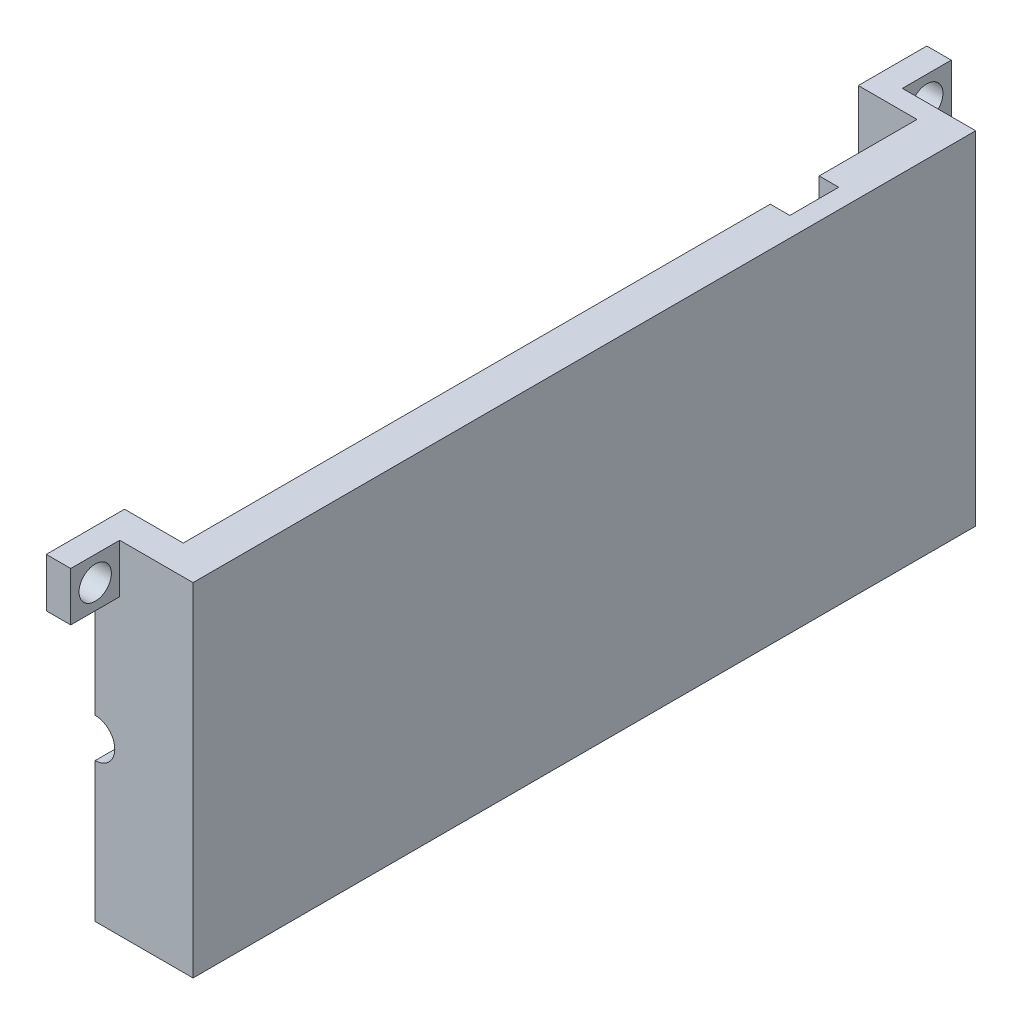
ISO-10303-21;
HEADER;
FILE_DESCRIPTION(('STEP AP214'),'2;1');
FILE_NAME('part.step','',(''),(''),'','','');
FILE_SCHEMA(('AUTOMOTIVE_DESIGN { 1 0 10303 214 1 1 1 1 }'));
ENDSEC;
DATA;
#1=APPLICATION_CONTEXT('core data for automotive mechanical design processes');
#2=APPLICATION_PROTOCOL_DEFINITION('international standard','automotive_design',2000,#1);
#3=PRODUCT_CONTEXT('',#1,'mechanical');
#4=PRODUCT('Part','Part','',(#3));
#5=PRODUCT_RELATED_PRODUCT_CATEGORY('part','',(#4));
#6=PRODUCT_DEFINITION_FORMATION('','',#4);
#7=PRODUCT_DEFINITION_CONTEXT('part definition',#1,'design');
#8=PRODUCT_DEFINITION('design','',#6,#7);
#9=PRODUCT_DEFINITION_SHAPE('','',#8);
#10=(LENGTH_UNIT() NAMED_UNIT(*) SI_UNIT(.MILLI.,.METRE.));
#11=(NAMED_UNIT(*) PLANE_ANGLE_UNIT() SI_UNIT($,.RADIAN.));
#12=(NAMED_UNIT(*) SI_UNIT($,.STERADIAN.) SOLID_ANGLE_UNIT());
#13=UNCERTAINTY_MEASURE_WITH_UNIT(LENGTH_MEASURE(1.E-05),#10,'distance_accuracy_value','');
#14=(GEOMETRIC_REPRESENTATION_CONTEXT(3) GLOBAL_UNCERTAINTY_ASSIGNED_CONTEXT((#13)) GLOBAL_UNIT_ASSIGNED_CONTEXT((#10,
#11,#12)) REPRESENTATION_CONTEXT('',''));
#15=CARTESIAN_POINT('',(0.,0.,0.));
#16=DIRECTION('',(0.,0.,1.));
#17=DIRECTION('',(1.,0.,0.));
#18=AXIS2_PLACEMENT_3D('',#15,#16,#17);
#19=CARTESIAN_POINT('',(9.99999999999998,0.,0.));
#20=DIRECTION('',(1.,0.,0.));
#21=DIRECTION('',(0.,0.,-1.));
#22=AXIS2_PLACEMENT_3D('',#19,#20,#21);
#23=PLANE('',#22);
#24=DIRECTION('',(0.,0.948683298050514,0.316227766016838));
#25=VECTOR('',#24,1.);
#26=CARTESIAN_POINT('',(9.99999999999998,5.,-53.));
#27=LINE('',#26,#25);
#28=CARTESIAN_POINT('',(9.99999999999998,18.25,-48.5833333333333));
#29=VERTEX_POINT('',#28);
#30=CARTESIAN_POINT('',(9.99999999999998,27.5,-45.5));
#31=VERTEX_POINT('',#30);
#32=EDGE_CURVE('E457',#29,#31,#27,.T.);
#33=ORIENTED_EDGE('',*,*,#32,.F.);
#34=DIRECTION('',(0.,0.,-1.));
#35=VECTOR('',#34,1.);
#36=CARTESIAN_POINT('',(9.99999999999998,18.25,5.65685424949239));
#37=LINE('',#36,#35);
#38=CARTESIAN_POINT('',(9.99999999999998,18.25,-42.4166666666666));
#39=VERTEX_POINT('',#38);
#40=EDGE_CURVE('E495',#39,#29,#37,.T.);
#41=ORIENTED_EDGE('',*,*,#40,.F.);
#42=DIRECTION('',(0.,-0.948683298050514,0.316227766016838));
#43=VECTOR('',#42,1.);
#44=CARTESIAN_POINT('',(9.99999999999998,27.5,-45.5));
#45=LINE('',#44,#43);
#46=EDGE_CURVE('E498',#31,#39,#45,.T.);
#47=ORIENTED_EDGE('',*,*,#46,.F.);
#48=EDGE_LOOP('',(#33,#41,#47));
#49=FACE_BOUND('',#48,.T.);
#50=ADVANCED_FACE('F32',(#49),#23,.F.);
#51=DIRECTION('',(0.,0.948683298050514,0.316227766016838));
#52=VECTOR('',#51,1.);
#53=CARTESIAN_POINT('',(9.99999999999998,5.,-33.));
#54=LINE('',#53,#52);
#55=CARTESIAN_POINT('',(9.99999999999998,18.25,-28.5833333333333));
#56=VERTEX_POINT('',#55);
#57=CARTESIAN_POINT('',(9.99999999999998,27.5,-25.5));
#58=VERTEX_POINT('',#57);
#59=EDGE_CURVE('E500',#56,#58,#54,.T.);
#60=ORIENTED_EDGE('',*,*,#59,.F.);
#61=DIRECTION('',(0.,0.,-1.));
#62=VECTOR('',#61,1.);
#63=CARTESIAN_POINT('',(9.99999999999998,18.25,5.65685424949239));
#64=LINE('',#63,#62);
#65=CARTESIAN_POINT('',(9.99999999999998,18.25,-22.4166666666666));
#66=VERTEX_POINT('',#65);
#67=EDGE_CURVE('E477',#66,#56,#64,.T.);
#68=ORIENTED_EDGE('',*,*,#67,.F.);
#69=DIRECTION('',(0.,-0.948683298050514,0.316227766016838));
#70=VECTOR('',#69,1.);
#71=CARTESIAN_POINT('',(9.99999999999998,27.5,-25.5));
#72=LINE('',#71,#70);
#73=EDGE_CURVE('E490',#58,#66,#72,.T.);
#74=ORIENTED_EDGE('',*,*,#73,.F.);
#75=EDGE_LOOP('',(#60,#68,#74));
#76=FACE_BOUND('',#75,.T.);
#77=ADVANCED_FACE('F571',(#76),#23,.F.);
#78=DIRECTION('',(0.,0.948683298050514,0.316227766016838));
#79=VECTOR('',#78,1.);
#80=CARTESIAN_POINT('',(9.99999999999997,5.,-73.));
#81=LINE('',#80,#79);
#82=CARTESIAN_POINT('',(9.99999999999998,18.25,-68.5833333333333));
#83=VERTEX_POINT('',#82);
#84=CARTESIAN_POINT('',(9.99999999999997,27.5,-65.5));
#85=VERTEX_POINT('',#84);
#86=EDGE_CURVE('E465',#83,#85,#81,.T.);
#87=ORIENTED_EDGE('',*,*,#86,.F.);
#88=DIRECTION('',(0.,0.,-1.));
#89=VECTOR('',#88,1.);
#90=CARTESIAN_POINT('',(9.99999999999998,18.25,5.65685424949239));
#91=LINE('',#90,#89);
#92=CARTESIAN_POINT('',(9.99999999999998,18.25,-62.4166666666667));
#93=VERTEX_POINT('',#92);
#94=EDGE_CURVE('E474',#93,#83,#91,.T.);
#95=ORIENTED_EDGE('',*,*,#94,.F.);
#96=DIRECTION('',(0.,-0.948683298050514,0.316227766016838));
#97=VECTOR('',#96,1.);
#98=CARTESIAN_POINT('',(9.99999999999997,27.5,-65.5));
#99=LINE('',#98,#97);
#100=EDGE_CURVE('E478',#85,#93,#99,.T.);
#101=ORIENTED_EDGE('',*,*,#100,.F.);
#102=EDGE_LOOP('',(#87,#95,#101));
#103=FACE_BOUND('',#102,.T.);
#104=ADVANCED_FACE('F576',(#103),#23,.F.);
#105=CARTESIAN_POINT('',(9.99999999999998,32.5,2.5));
#106=DIRECTION('',(1.,0.,0.));
#107=DIRECTION('',(0.,0.,-1.));
#108=AXIS2_PLACEMENT_3D('',#105,#106,#107);
#109=CIRCLE('',#108,1.65);
#110=CARTESIAN_POINT('',(9.99999999999998,32.5,0.85));
#111=VERTEX_POINT('',#110);
#112=EDGE_CURVE('E11',#111,#111,#109,.T.);
#113=ORIENTED_EDGE('',*,*,#112,.T.);
#114=EDGE_LOOP('',(#113));
#115=FACE_BOUND('',#114,.T.);
#116=DIRECTION('',(0.,0.,1.));
#117=VECTOR('',#116,1.);
#118=CARTESIAN_POINT('',(9.99999999999998,30.,5.));
#119=LINE('',#118,#117);
#120=CARTESIAN_POINT('',(9.99999999999998,30.,0.));
#121=VERTEX_POINT('',#120);
#122=CARTESIAN_POINT('',(9.99999999999998,30.,5.));
#123=VERTEX_POINT('',#122);
#124=EDGE_CURVE('E453',#121,#123,#119,.T.);
#125=ORIENTED_EDGE('',*,*,#124,.T.);
#126=DIRECTION('',(0.,1.,0.));
#127=VECTOR('',#126,1.);
#128=CARTESIAN_POINT('',(9.99999999999998,0.,5.));
#129=LINE('',#128,#127);
#130=CARTESIAN_POINT('',(9.99999999999998,35.,5.));
#131=VERTEX_POINT('',#130);
#132=EDGE_CURVE('E41',#123,#131,#129,.T.);
#133=ORIENTED_EDGE('',*,*,#132,.T.);
#134=DIRECTION('',(0.,0.,1.));
#135=VECTOR('',#134,1.);
#136=CARTESIAN_POINT('',(9.99999999999998,35.,0.));
#137=LINE('',#136,#135);
#138=CARTESIAN_POINT('',(9.99999999999998,35.,-2.99999999999999));
#139=VERTEX_POINT('',#138);
#140=EDGE_CURVE('E48',#139,#131,#137,.T.);
#141=ORIENTED_EDGE('',*,*,#140,.F.);
#142=DIRECTION('',(0.,-1.,0.));
#143=VECTOR('',#142,1.);
#144=CARTESIAN_POINT('',(9.99999999999998,5.,-2.99999999999999));
#145=LINE('',#144,#143);
#146=CARTESIAN_POINT('',(9.99999999999998,18.25,-2.99999999999999));
#147=VERTEX_POINT('',#146);
#148=EDGE_CURVE('E442',#139,#147,#145,.T.);
#149=ORIENTED_EDGE('',*,*,#148,.T.);
#150=DIRECTION('',(0.,0.,-1.));
#151=VECTOR('',#150,1.);
#152=CARTESIAN_POINT('',(9.99999999999998,18.25,5.65685424949239));
#153=LINE('',#152,#151);
#154=CARTESIAN_POINT('',(9.99999999999998,18.25,0.));
#155=VERTEX_POINT('',#154);
#156=EDGE_CURVE('E438',#155,#147,#153,.T.);
#157=ORIENTED_EDGE('',*,*,#156,.F.);
#158=DIRECTION('',(0.,-1.,0.));
#159=VECTOR('',#158,1.);
#160=CARTESIAN_POINT('',(9.99999999999998,35.,0.));
#161=LINE('',#160,#159);
#162=EDGE_CURVE('E469',#121,#155,#161,.T.);
#163=ORIENTED_EDGE('',*,*,#162,.F.);
#164=EDGE_LOOP('',(#125,#133,#141,#149,#157,#163));
#165=FACE_BOUND('',#164,.T.);
#166=ADVANCED_FACE('F589',(#115,#165),#23,.F.);
#167=DIRECTION('',(0.,0.,-1.));
#168=VECTOR('',#167,1.);
#169=CARTESIAN_POINT('',(9.99999999999998,5.,-78.));
#170=LINE('',#169,#168);
#171=CARTESIAN_POINT('',(9.99999999999998,5.,-33.));
#172=VERTEX_POINT('',#171);
#173=CARTESIAN_POINT('',(9.99999999999998,5.,-38.));
#174=VERTEX_POINT('',#173);
#175=EDGE_CURVE('E468',#172,#174,#170,.T.);
#176=ORIENTED_EDGE('',*,*,#175,.T.);
#177=CARTESIAN_POINT('',(9.99999999999998,14.25,-41.0833333333333));
#178=VERTEX_POINT('',#177);
#179=EDGE_CURVE('E489',#178,#174,#45,.T.);
#180=ORIENTED_EDGE('',*,*,#179,.F.);
#181=DIRECTION('',(0.,0.,-1.));
#182=VECTOR('',#181,1.);
#183=CARTESIAN_POINT('',(9.99999999999998,14.25,5.65685424949239));
#184=LINE('',#183,#182);
#185=CARTESIAN_POINT('',(9.99999999999998,14.25,-49.9166666666666));
#186=VERTEX_POINT('',#185);
#187=EDGE_CURVE('E496',#186,#178,#184,.F.);
#188=ORIENTED_EDGE('',*,*,#187,.F.);
#189=CARTESIAN_POINT('',(9.99999999999998,5.,-53.));
#190=VERTEX_POINT('',#189);
#191=EDGE_CURVE('E487',#190,#186,#27,.T.);
#192=ORIENTED_EDGE('',*,*,#191,.F.);
#193=DIRECTION('',(0.,0.,-1.));
#194=VECTOR('',#193,1.);
#195=CARTESIAN_POINT('',(9.99999999999998,5.,-78.));
#196=LINE('',#195,#194);
#197=CARTESIAN_POINT('',(9.99999999999997,5.,-58.));
#198=VERTEX_POINT('',#197);
#199=EDGE_CURVE('E484',#190,#198,#196,.T.);
#200=ORIENTED_EDGE('',*,*,#199,.T.);
#201=CARTESIAN_POINT('',(9.99999999999998,14.25,-61.0833333333333));
#202=VERTEX_POINT('',#201);
#203=EDGE_CURVE('E464',#202,#198,#99,.T.);
#204=ORIENTED_EDGE('',*,*,#203,.F.);
#205=DIRECTION('',(0.,0.,-1.));
#206=VECTOR('',#205,1.);
#207=CARTESIAN_POINT('',(9.99999999999998,14.25,5.65685424949239));
#208=LINE('',#207,#206);
#209=CARTESIAN_POINT('',(9.99999999999998,14.25,-69.9166666666667));
#210=VERTEX_POINT('',#209);
#211=EDGE_CURVE('E475',#210,#202,#208,.F.);
#212=ORIENTED_EDGE('',*,*,#211,.F.);
#213=CARTESIAN_POINT('',(9.99999999999997,5.,-73.));
#214=VERTEX_POINT('',#213);
#215=EDGE_CURVE('E462',#214,#210,#81,.T.);
#216=ORIENTED_EDGE('',*,*,#215,.F.);
#217=DIRECTION('',(0.,0.,-1.));
#218=VECTOR('',#217,1.);
#219=CARTESIAN_POINT('',(9.99999999999998,5.,-78.));
#220=LINE('',#219,#218);
#221=CARTESIAN_POINT('',(9.99999999999998,5.,-78.));
#222=VERTEX_POINT('',#221);
#223=EDGE_CURVE('E458',#214,#222,#220,.T.);
#224=ORIENTED_EDGE('',*,*,#223,.T.);
#225=DIRECTION('',(0.,1.,0.));
#226=VECTOR('',#225,1.);
#227=CARTESIAN_POINT('',(9.99999999999998,5.,-78.));
#228=LINE('',#227,#226);
#229=CARTESIAN_POINT('',(9.99999999999998,14.25,-78.));
#230=VERTEX_POINT('',#229);
#231=EDGE_CURVE('E443',#222,#230,#228,.T.);
#232=ORIENTED_EDGE('',*,*,#231,.T.);
#233=DIRECTION('',(0.,0.,-1.));
#234=VECTOR('',#233,1.);
#235=CARTESIAN_POINT('',(9.99999999999998,14.25,5.65685424949239));
#236=LINE('',#235,#234);
#237=CARTESIAN_POINT('',(9.99999999999998,14.25,-80.));
#238=VERTEX_POINT('',#237);
#239=EDGE_CURVE('E436',#238,#230,#236,.F.);
#240=ORIENTED_EDGE('',*,*,#239,.F.);
#241=DIRECTION('',(0.,1.,0.));
#242=VECTOR('',#241,1.);
#243=CARTESIAN_POINT('',(9.99999999999998,35.,-80.));
#244=LINE('',#243,#242);
#245=CARTESIAN_POINT('',(9.99999999999998,0.,-80.));
#246=VERTEX_POINT('',#245);
#247=EDGE_CURVE('E447',#246,#238,#244,.T.);
#248=ORIENTED_EDGE('',*,*,#247,.F.);
#249=DIRECTION('',(0.,0.,1.));
#250=VECTOR('',#249,1.);
#251=CARTESIAN_POINT('',(9.99999999999998,0.,0.));
#252=LINE('',#251,#250);
#253=CARTESIAN_POINT('',(9.99999999999998,0.,0.));
#254=VERTEX_POINT('',#253);
#255=EDGE_CURVE('E449',#246,#254,#252,.T.);
#256=ORIENTED_EDGE('',*,*,#255,.T.);
#257=CARTESIAN_POINT('',(9.99999999999998,14.25,0.));
#258=VERTEX_POINT('',#257);
#259=EDGE_CURVE('E471',#258,#254,#161,.T.);
#260=ORIENTED_EDGE('',*,*,#259,.F.);
#261=DIRECTION('',(0.,0.,-1.));
#262=VECTOR('',#261,1.);
#263=CARTESIAN_POINT('',(9.99999999999998,14.25,5.65685424949239));
#264=LINE('',#263,#262);
#265=CARTESIAN_POINT('',(9.99999999999998,14.25,-2.99999999999999));
#266=VERTEX_POINT('',#265);
#267=EDGE_CURVE('E472',#266,#258,#264,.F.);
#268=ORIENTED_EDGE('',*,*,#267,.F.);
#269=CARTESIAN_POINT('',(9.99999999999998,5.,-2.99999999999999));
#270=VERTEX_POINT('',#269);
#271=EDGE_CURVE('E454',#266,#270,#145,.T.);
#272=ORIENTED_EDGE('',*,*,#271,.T.);
#273=DIRECTION('',(0.,0.,-1.));
#274=VECTOR('',#273,1.);
#275=CARTESIAN_POINT('',(9.99999999999998,5.,-78.));
#276=LINE('',#275,#274);
#277=CARTESIAN_POINT('',(9.99999999999998,5.,-18.));
#278=VERTEX_POINT('',#277);
#279=EDGE_CURVE('E461',#270,#278,#276,.T.);
#280=ORIENTED_EDGE('',*,*,#279,.T.);
#281=CARTESIAN_POINT('',(9.99999999999998,14.25,-21.0833333333333));
#282=VERTEX_POINT('',#281);
#283=EDGE_CURVE('E492',#282,#278,#72,.T.);
#284=ORIENTED_EDGE('',*,*,#283,.F.);
#285=DIRECTION('',(0.,0.,-1.));
#286=VECTOR('',#285,1.);
#287=CARTESIAN_POINT('',(9.99999999999998,14.25,5.65685424949239));
#288=LINE('',#287,#286);
#289=CARTESIAN_POINT('',(9.99999999999998,14.25,-29.9166666666666));
#290=VERTEX_POINT('',#289);
#291=EDGE_CURVE('E493',#290,#282,#288,.F.);
#292=ORIENTED_EDGE('',*,*,#291,.F.);
#293=EDGE_CURVE('E501',#172,#290,#54,.T.);
#294=ORIENTED_EDGE('',*,*,#293,.F.);
#295=EDGE_LOOP('',(#176,#180,#188,#192,#200,#204,#212,#216,#224,#232,#240,#248,#256,#260,#268,
#272,#280,#284,#292,#294));
#296=FACE_BOUND('',#295,.T.);
#297=ADVANCED_FACE('F34',(#296),#23,.F.);
#298=CARTESIAN_POINT('',(9.99999999999998,18.25,-80.));
#299=VERTEX_POINT('',#298);
#300=CARTESIAN_POINT('',(9.99999999999998,30.,-80.));
#301=VERTEX_POINT('',#300);
#302=EDGE_CURVE('E446',#299,#301,#244,.T.);
#303=ORIENTED_EDGE('',*,*,#302,.F.);
#304=DIRECTION('',(0.,0.,-1.));
#305=VECTOR('',#304,1.);
#306=CARTESIAN_POINT('',(9.99999999999998,18.25,5.65685424949239));
#307=LINE('',#306,#305);
#308=CARTESIAN_POINT('',(9.99999999999998,18.25,-78.));
#309=VERTEX_POINT('',#308);
#310=EDGE_CURVE('E429',#309,#299,#307,.T.);
#311=ORIENTED_EDGE('',*,*,#310,.F.);
#312=CARTESIAN_POINT('',(9.99999999999998,35.,-78.));
#313=VERTEX_POINT('',#312);
#314=EDGE_CURVE('E439',#309,#313,#228,.T.);
#315=ORIENTED_EDGE('',*,*,#314,.T.);
#316=CARTESIAN_POINT('',(9.99999999999998,35.,-85.));
#317=VERTEX_POINT('',#316);
#318=EDGE_CURVE('E444',#317,#313,#137,.T.);
#319=ORIENTED_EDGE('',*,*,#318,.F.);
#320=DIRECTION('',(0.,-1.,0.));
#321=VECTOR('',#320,1.);
#322=CARTESIAN_POINT('',(9.99999999999998,0.,-85.));
#323=LINE('',#322,#321);
#324=CARTESIAN_POINT('',(9.99999999999998,30.,-85.));
#325=VERTEX_POINT('',#324);
#326=EDGE_CURVE('E450',#317,#325,#323,.T.);
#327=ORIENTED_EDGE('',*,*,#326,.T.);
#328=DIRECTION('',(0.,0.,-1.));
#329=VECTOR('',#328,1.);
#330=CARTESIAN_POINT('',(9.99999999999998,30.,-85.));
#331=LINE('',#330,#329);
#332=EDGE_CURVE('E455',#301,#325,#331,.T.);
#333=ORIENTED_EDGE('',*,*,#332,.F.);
#334=EDGE_LOOP('',(#303,#311,#315,#319,#327,#333));
#335=FACE_BOUND('',#334,.T.);
#336=CARTESIAN_POINT('',(9.99999999999998,32.5,-82.5));
#337=DIRECTION('',(1.,0.,0.));
#338=DIRECTION('',(0.,0.,-1.));
#339=AXIS2_PLACEMENT_3D('',#336,#337,#338);
#340=CIRCLE('',#339,1.65);
#341=CARTESIAN_POINT('',(9.99999999999998,32.5,-84.15));
#342=VERTEX_POINT('',#341);
#343=EDGE_CURVE('E36',#342,#342,#340,.F.);
#344=ORIENTED_EDGE('',*,*,#343,.F.);
#345=EDGE_LOOP('',(#344));
#346=FACE_BOUND('',#345,.T.);
#347=ADVANCED_FACE('F572',(#335,#346),#23,.F.);
#348=CARTESIAN_POINT('',(16.,35.,-63.));
#349=DIRECTION('',(0.,0.,1.));
#350=DIRECTION('',(0.,-1.,0.));
#351=AXIS2_PLACEMENT_3D('',#348,#349,#350);
#352=PLANE('',#351);
#353=DIRECTION('',(0.,-1.,0.));
#354=VECTOR('',#353,1.);
#355=CARTESIAN_POINT('',(16.,32.5,-63.));
#356=LINE('',#355,#354);
#357=CARTESIAN_POINT('',(16.,35.,-63.));
#358=VERTEX_POINT('',#357);
#359=CARTESIAN_POINT('',(16.,30.,-63.));
#360=VERTEX_POINT('',#359);
#361=EDGE_CURVE('E319',#358,#360,#356,.T.);
#362=ORIENTED_EDGE('',*,*,#361,.F.);
#363=DIRECTION('',(1.,0.,0.));
#364=VECTOR('',#363,1.);
#365=CARTESIAN_POINT('',(17.,35.,-63.));
#366=LINE('',#365,#364);
#367=CARTESIAN_POINT('',(18.,35.,-63.));
#368=VERTEX_POINT('',#367);
#369=EDGE_CURVE('E333',#358,#368,#366,.T.);
#370=ORIENTED_EDGE('',*,*,#369,.T.);
#371=DIRECTION('',(0.371390676354104,0.928476690885259,0.));
#372=VECTOR('',#371,1.);
#373=CARTESIAN_POINT('',(17.,32.5,-63.));
#374=LINE('',#373,#372);
#375=EDGE_CURVE('E323',#360,#368,#374,.T.);
#376=ORIENTED_EDGE('',*,*,#375,.F.);
#377=EDGE_LOOP('',(#362,#370,#376));
#378=FACE_BOUND('',#377,.T.);
#379=ADVANCED_FACE('F579',(#378),#352,.F.);
#380=CARTESIAN_POINT('',(16.,30.,-63.));
#381=DIRECTION('',(0.928476690885259,-0.371390676354104,0.));
#382=DIRECTION('',(0.,0.,-1.));
#383=AXIS2_PLACEMENT_3D('',#380,#381,#382);
#384=PLANE('',#383);
#385=DIRECTION('',(0.,0.,-1.));
#386=VECTOR('',#385,1.);
#387=CARTESIAN_POINT('',(16.,30.,-65.5));
#388=LINE('',#387,#386);
#389=CARTESIAN_POINT('',(16.,30.,-68.));
#390=VERTEX_POINT('',#389);
#391=EDGE_CURVE('E326',#360,#390,#388,.T.);
#392=ORIENTED_EDGE('',*,*,#391,.F.);
#393=ORIENTED_EDGE('',*,*,#375,.T.);
#394=DIRECTION('',(0.,0.,-1.));
#395=VECTOR('',#394,1.);
#396=CARTESIAN_POINT('',(18.,35.,-65.5));
#397=LINE('',#396,#395);
#398=CARTESIAN_POINT('',(18.,35.,-68.));
#399=VERTEX_POINT('',#398);
#400=EDGE_CURVE('E335',#368,#399,#397,.T.);
#401=ORIENTED_EDGE('',*,*,#400,.T.);
#402=DIRECTION('',(0.371390676354104,0.928476690885259,0.));
#403=VECTOR('',#402,1.);
#404=CARTESIAN_POINT('',(17.,32.5,-68.));
#405=LINE('',#404,#403);
#406=EDGE_CURVE('E329',#390,#399,#405,.T.);
#407=ORIENTED_EDGE('',*,*,#406,.F.);
#408=EDGE_LOOP('',(#392,#393,#401,#407));
#409=FACE_BOUND('',#408,.T.);
#410=ADVANCED_FACE('F586',(#409),#384,.F.);
#411=CARTESIAN_POINT('',(16.,30.,-68.));
#412=DIRECTION('',(0.,0.,-1.));
#413=DIRECTION('',(0.,1.,0.));
#414=AXIS2_PLACEMENT_3D('',#411,#412,#413);
#415=PLANE('',#414);
#416=DIRECTION('',(0.,1.,0.));
#417=VECTOR('',#416,1.);
#418=CARTESIAN_POINT('',(16.,32.5,-68.));
#419=LINE('',#418,#417);
#420=CARTESIAN_POINT('',(16.,35.,-68.));
#421=VERTEX_POINT('',#420);
#422=EDGE_CURVE('E331',#390,#421,#419,.T.);
#423=ORIENTED_EDGE('',*,*,#422,.F.);
#424=ORIENTED_EDGE('',*,*,#406,.T.);
#425=DIRECTION('',(-1.,0.,0.));
#426=VECTOR('',#425,1.);
#427=CARTESIAN_POINT('',(17.,35.,-68.));
#428=LINE('',#427,#426);
#429=EDGE_CURVE('E318',#399,#421,#428,.T.);
#430=ORIENTED_EDGE('',*,*,#429,.T.);
#431=EDGE_LOOP('',(#423,#424,#430));
#432=FACE_BOUND('',#431,.T.);
#433=ADVANCED_FACE('F612',(#432),#415,.F.);
#434=CARTESIAN_POINT('',(20.,35.,0.));
#435=DIRECTION('',(-1.,0.,0.));
#436=DIRECTION('',(0.,0.,1.));
#437=AXIS2_PLACEMENT_3D('',#434,#435,#436);
#438=PLANE('',#437);
#439=DIRECTION('',(0.,0.,-1.));
#440=VECTOR('',#439,1.);
#441=CARTESIAN_POINT('',(20.,0.,0.));
#442=LINE('',#441,#440);
#443=CARTESIAN_POINT('',(20.,0.,0.));
#444=VERTEX_POINT('',#443);
#445=CARTESIAN_POINT('',(20.,0.,-80.));
#446=VERTEX_POINT('',#445);
#447=EDGE_CURVE('E420',#444,#446,#442,.T.);
#448=ORIENTED_EDGE('',*,*,#447,.T.);
#449=DIRECTION('',(0.,-1.,0.));
#450=VECTOR('',#449,1.);
#451=CARTESIAN_POINT('',(20.,35.,-80.));
#452=LINE('',#451,#450);
#453=CARTESIAN_POINT('',(20.,35.,-80.));
#454=VERTEX_POINT('',#453);
#455=EDGE_CURVE('E418',#454,#446,#452,.T.);
#456=ORIENTED_EDGE('',*,*,#455,.F.);
#457=DIRECTION('',(0.,0.,-1.));
#458=VECTOR('',#457,1.);
#459=CARTESIAN_POINT('',(20.,35.,0.));
#460=LINE('',#459,#458);
#461=CARTESIAN_POINT('',(20.,35.,0.));
#462=VERTEX_POINT('',#461);
#463=EDGE_CURVE('E412',#462,#454,#460,.T.);
#464=ORIENTED_EDGE('',*,*,#463,.F.);
#465=DIRECTION('',(0.,-1.,0.));
#466=VECTOR('',#465,1.);
#467=CARTESIAN_POINT('',(20.,35.,0.));
#468=LINE('',#467,#466);
#469=EDGE_CURVE('E426',#462,#444,#468,.T.);
#470=ORIENTED_EDGE('',*,*,#469,.T.);
#471=EDGE_LOOP('',(#448,#456,#464,#470));
#472=FACE_BOUND('',#471,.T.);
#473=ADVANCED_FACE('F609',(#472),#438,.F.);
#474=CARTESIAN_POINT('',(16.,5.,-78.));
#475=DIRECTION('',(0.,1.,0.));
#476=DIRECTION('',(0.,0.,1.));
#477=AXIS2_PLACEMENT_3D('',#474,#475,#476);
#478=PLANE('',#477);
#479=ORIENTED_EDGE('',*,*,#279,.F.);
#480=DIRECTION('',(-1.,0.,0.));
#481=VECTOR('',#480,1.);
#482=CARTESIAN_POINT('',(16.,5.,-2.99999999999999));
#483=LINE('',#482,#481);
#484=CARTESIAN_POINT('',(16.,5.,-2.99999999999999));
#485=VERTEX_POINT('',#484);
#486=EDGE_CURVE('E398',#485,#270,#483,.T.);
#487=ORIENTED_EDGE('',*,*,#486,.F.);
#488=DIRECTION('',(0.,0.,-1.));
#489=VECTOR('',#488,1.);
#490=CARTESIAN_POINT('',(16.,5.,-78.));
#491=LINE('',#490,#489);
#492=CARTESIAN_POINT('',(16.,5.,-18.));
#493=VERTEX_POINT('',#492);
#494=EDGE_CURVE('E385',#485,#493,#491,.T.);
#495=ORIENTED_EDGE('',*,*,#494,.T.);
#496=DIRECTION('',(-1.,0.,0.));
#497=VECTOR('',#496,1.);
#498=CARTESIAN_POINT('',(43.0416345659799,5.,-18.));
#499=LINE('',#498,#497);
#500=EDGE_CURVE('E322',#493,#278,#499,.T.);
#501=ORIENTED_EDGE('',*,*,#500,.T.);
#502=EDGE_LOOP('',(#479,#487,#495,#501));
#503=FACE_BOUND('',#502,.T.);
#504=ADVANCED_FACE('F611',(#503),#478,.T.);
#505=ORIENTED_EDGE('',*,*,#175,.F.);
#506=DIRECTION('',(-1.,0.,0.));
#507=VECTOR('',#506,1.);
#508=CARTESIAN_POINT('',(43.0416345659799,5.,-33.));
#509=LINE('',#508,#507);
#510=CARTESIAN_POINT('',(16.,5.,-33.));
#511=VERTEX_POINT('',#510);
#512=EDGE_CURVE('E365',#511,#172,#509,.T.);
#513=ORIENTED_EDGE('',*,*,#512,.F.);
#514=CARTESIAN_POINT('',(16.,5.,-38.));
#515=VERTEX_POINT('',#514);
#516=EDGE_CURVE('E389',#511,#515,#491,.T.);
#517=ORIENTED_EDGE('',*,*,#516,.T.);
#518=DIRECTION('',(-1.,0.,0.));
#519=VECTOR('',#518,1.);
#520=CARTESIAN_POINT('',(43.0416345659799,5.,-38.));
#521=LINE('',#520,#519);
#522=EDGE_CURVE('E345',#515,#174,#521,.T.);
#523=ORIENTED_EDGE('',*,*,#522,.T.);
#524=EDGE_LOOP('',(#505,#513,#517,#523));
#525=FACE_BOUND('',#524,.T.);
#526=ADVANCED_FACE('F699',(#525),#478,.T.);
#527=CARTESIAN_POINT('',(16.,5.,-78.));
#528=DIRECTION('',(-1.,0.,0.));
#529=DIRECTION('',(0.,0.,1.));
#530=AXIS2_PLACEMENT_3D('',#527,#528,#529);
#531=PLANE('',#530);
#532=ORIENTED_EDGE('',*,*,#422,.T.);
#533=DIRECTION('',(0.,0.,1.));
#534=VECTOR('',#533,1.);
#535=CARTESIAN_POINT('',(16.,35.,-78.));
#536=LINE('',#535,#534);
#537=CARTESIAN_POINT('',(16.,35.,-78.));
#538=VERTEX_POINT('',#537);
#539=EDGE_CURVE('E393',#538,#421,#536,.T.);
#540=ORIENTED_EDGE('',*,*,#539,.F.);
#541=DIRECTION('',(0.,1.,0.));
#542=VECTOR('',#541,1.);
#543=CARTESIAN_POINT('',(16.,5.,-78.));
#544=LINE('',#543,#542);
#545=CARTESIAN_POINT('',(16.,5.,-78.));
#546=VERTEX_POINT('',#545);
#547=EDGE_CURVE('E388',#546,#538,#544,.T.);
#548=ORIENTED_EDGE('',*,*,#547,.F.);
#549=CARTESIAN_POINT('',(16.,5.,-73.));
#550=VERTEX_POINT('',#549);
#551=EDGE_CURVE('E373',#550,#546,#491,.T.);
#552=ORIENTED_EDGE('',*,*,#551,.F.);
#553=DIRECTION('',(0.,-0.948683298050514,-0.316227766016838));
#554=VECTOR('',#553,1.);
#555=CARTESIAN_POINT('',(16.,5.,-73.));
#556=LINE('',#555,#554);
#557=CARTESIAN_POINT('',(16.,27.5,-65.5));
#558=VERTEX_POINT('',#557);
#559=EDGE_CURVE('E370',#558,#550,#556,.T.);
#560=ORIENTED_EDGE('',*,*,#559,.F.);
#561=DIRECTION('',(0.,0.948683298050514,-0.316227766016838));
#562=VECTOR('',#561,1.);
#563=CARTESIAN_POINT('',(16.,27.5,-65.5));
#564=LINE('',#563,#562);
#565=CARTESIAN_POINT('',(16.,5.,-58.));
#566=VERTEX_POINT('',#565);
#567=EDGE_CURVE('E374',#566,#558,#564,.T.);
#568=ORIENTED_EDGE('',*,*,#567,.F.);
#569=CARTESIAN_POINT('',(16.,5.,-53.));
#570=VERTEX_POINT('',#569);
#571=EDGE_CURVE('E390',#570,#566,#491,.T.);
#572=ORIENTED_EDGE('',*,*,#571,.F.);
#573=DIRECTION('',(0.,-0.948683298050514,-0.316227766016838));
#574=VECTOR('',#573,1.);
#575=CARTESIAN_POINT('',(16.,5.,-53.));
#576=LINE('',#575,#574);
#577=CARTESIAN_POINT('',(16.,27.5,-45.5));
#578=VERTEX_POINT('',#577);
#579=EDGE_CURVE('E340',#578,#570,#576,.T.);
#580=ORIENTED_EDGE('',*,*,#579,.F.);
#581=DIRECTION('',(0.,0.948683298050514,-0.316227766016838));
#582=VECTOR('',#581,1.);
#583=CARTESIAN_POINT('',(16.,27.5,-45.5));
#584=LINE('',#583,#582);
#585=EDGE_CURVE('E344',#515,#578,#584,.T.);
#586=ORIENTED_EDGE('',*,*,#585,.F.);
#587=ORIENTED_EDGE('',*,*,#516,.F.);
#588=DIRECTION('',(0.,-0.948683298050514,-0.316227766016838));
#589=VECTOR('',#588,1.);
#590=CARTESIAN_POINT('',(16.,5.,-33.));
#591=LINE('',#590,#589);
#592=CARTESIAN_POINT('',(16.,27.5,-25.5));
#593=VERTEX_POINT('',#592);
#594=EDGE_CURVE('E349',#593,#511,#591,.T.);
#595=ORIENTED_EDGE('',*,*,#594,.F.);
#596=DIRECTION('',(0.,0.948683298050514,-0.316227766016838));
#597=VECTOR('',#596,1.);
#598=CARTESIAN_POINT('',(16.,27.5,-25.5));
#599=LINE('',#598,#597);
#600=EDGE_CURVE('E359',#493,#593,#599,.T.);
#601=ORIENTED_EDGE('',*,*,#600,.F.);
#602=ORIENTED_EDGE('',*,*,#494,.F.);
#603=DIRECTION('',(0.,-1.,0.));
#604=VECTOR('',#603,1.);
#605=CARTESIAN_POINT('',(16.,5.,-2.99999999999999));
#606=LINE('',#605,#604);
#607=CARTESIAN_POINT('',(16.,35.,-2.99999999999999));
#608=VERTEX_POINT('',#607);
#609=EDGE_CURVE('E396',#608,#485,#606,.T.);
#610=ORIENTED_EDGE('',*,*,#609,.F.);
#611=EDGE_CURVE('E392',#358,#608,#536,.T.);
#612=ORIENTED_EDGE('',*,*,#611,.F.);
#613=ORIENTED_EDGE('',*,*,#361,.T.);
#614=ORIENTED_EDGE('',*,*,#391,.T.);
#615=EDGE_LOOP('',(#532,#540,#548,#552,#560,#568,#572,#580,#586,#587,#595,#601,#602,#610,#612,
#613,#614));
#616=FACE_BOUND('',#615,.T.);
#617=ADVANCED_FACE('F667',(#616),#531,.T.);
#618=ORIENTED_EDGE('',*,*,#199,.F.);
#619=DIRECTION('',(-1.,0.,0.));
#620=VECTOR('',#619,1.);
#621=CARTESIAN_POINT('',(43.0416345659799,5.,-53.));
#622=LINE('',#621,#620);
#623=EDGE_CURVE('E352',#570,#190,#622,.T.);
#624=ORIENTED_EDGE('',*,*,#623,.F.);
#625=ORIENTED_EDGE('',*,*,#571,.T.);
#626=DIRECTION('',(-1.,0.,0.));
#627=VECTOR('',#626,1.);
#628=CARTESIAN_POINT('',(43.0416345659799,5.,-58.));
#629=LINE('',#628,#627);
#630=EDGE_CURVE('E343',#566,#198,#629,.T.);
#631=ORIENTED_EDGE('',*,*,#630,.T.);
#632=EDGE_LOOP('',(#618,#624,#625,#631));
#633=FACE_BOUND('',#632,.T.);
#634=ADVANCED_FACE('F716',(#633),#478,.T.);
#635=CARTESIAN_POINT('',(43.0416345659799,27.5,-45.5));
#636=DIRECTION('',(0.,-0.316227766016838,-0.948683298050514));
#637=DIRECTION('',(0.,0.948683298050514,-0.316227766016838));
#638=AXIS2_PLACEMENT_3D('',#635,#636,#637);
#639=PLANE('',#638);
#640=DIRECTION('',(-1.,0.,0.));
#641=VECTOR('',#640,1.);
#642=CARTESIAN_POINT('',(43.0416345659799,27.5,-45.5));
#643=LINE('',#642,#641);
#644=EDGE_CURVE('E348',#578,#31,#643,.T.);
#645=ORIENTED_EDGE('',*,*,#644,.T.);
#646=ORIENTED_EDGE('',*,*,#46,.T.);
#647=CARTESIAN_POINT('',(9.99999999999998,16.25,-41.75));
#648=DIRECTION('',(0.,-0.316227766016838,-0.948683298050514));
#649=DIRECTION('',(0.,0.948683298050514,-0.316227766016838));
#650=AXIS2_PLACEMENT_3D('',#647,#648,#649);
#651=ELLIPSE('',#650,2.10818510677892,2.);
#652=EDGE_CURVE('E433',#39,#178,#651,.T.);
#653=ORIENTED_EDGE('',*,*,#652,.T.);
#654=ORIENTED_EDGE('',*,*,#179,.T.);
#655=ORIENTED_EDGE('',*,*,#522,.F.);
#656=ORIENTED_EDGE('',*,*,#585,.T.);
#657=EDGE_LOOP('',(#645,#646,#653,#654,#655,#656));
#658=FACE_BOUND('',#657,.T.);
#659=ADVANCED_FACE('F529',(#658),#639,.F.);
#660=CARTESIAN_POINT('',(43.0416345659799,5.,-53.));
#661=DIRECTION('',(0.,-0.316227766016838,0.948683298050514));
#662=DIRECTION('',(0.,-0.948683298050514,-0.316227766016838));
#663=AXIS2_PLACEMENT_3D('',#660,#661,#662);
#664=PLANE('',#663);
#665=ORIENTED_EDGE('',*,*,#623,.T.);
#666=ORIENTED_EDGE('',*,*,#191,.T.);
#667=CARTESIAN_POINT('',(9.99999999999998,16.25,-49.25));
#668=DIRECTION('',(0.,-0.316227766016838,0.948683298050514));
#669=DIRECTION('',(0.,-0.948683298050514,-0.316227766016838));
#670=AXIS2_PLACEMENT_3D('',#667,#668,#669);
#671=ELLIPSE('',#670,2.10818510677892,2.);
#672=EDGE_CURVE('E430',#186,#29,#671,.T.);
#673=ORIENTED_EDGE('',*,*,#672,.T.);
#674=ORIENTED_EDGE('',*,*,#32,.T.);
#675=ORIENTED_EDGE('',*,*,#644,.F.);
#676=ORIENTED_EDGE('',*,*,#579,.T.);
#677=EDGE_LOOP('',(#665,#666,#673,#674,#675,#676));
#678=FACE_BOUND('',#677,.T.);
#679=ADVANCED_FACE('F521',(#678),#664,.F.);
#680=CARTESIAN_POINT('',(9.99999999999998,16.25,5.65685424949239));
#681=DIRECTION('',(0.,0.,-1.));
#682=DIRECTION('',(-1.,0.,0.));
#683=AXIS2_PLACEMENT_3D('',#680,#681,#682);
#684=CYLINDRICAL_SURFACE('',#683,2.);
#685=ORIENTED_EDGE('',*,*,#672,.F.);
#686=ORIENTED_EDGE('',*,*,#187,.T.);
#687=ORIENTED_EDGE('',*,*,#652,.F.);
#688=ORIENTED_EDGE('',*,*,#40,.T.);
#689=EDGE_LOOP('',(#685,#686,#687,#688));
#690=FACE_BOUND('',#689,.T.);
#691=ADVANCED_FACE('F515',(#690),#684,.F.);
#692=CARTESIAN_POINT('',(43.0416345659799,27.5,-25.5));
#693=DIRECTION('',(0.,-0.316227766016838,-0.948683298050514));
#694=DIRECTION('',(0.,0.948683298050514,-0.316227766016838));
#695=AXIS2_PLACEMENT_3D('',#692,#693,#694);
#696=PLANE('',#695);
#697=DIRECTION('',(-1.,0.,0.));
#698=VECTOR('',#697,1.);
#699=CARTESIAN_POINT('',(43.0416345659799,27.5,-25.5));
#700=LINE('',#699,#698);
#701=EDGE_CURVE('E362',#593,#58,#700,.T.);
#702=ORIENTED_EDGE('',*,*,#701,.T.);
#703=ORIENTED_EDGE('',*,*,#73,.T.);
#704=CARTESIAN_POINT('',(9.99999999999998,16.25,-21.75));
#705=DIRECTION('',(0.,-0.316227766016838,-0.948683298050514));
#706=DIRECTION('',(0.,0.948683298050514,-0.316227766016838));
#707=AXIS2_PLACEMENT_3D('',#704,#705,#706);
#708=ELLIPSE('',#707,2.10818510677892,2.);
#709=EDGE_CURVE('E533',#66,#282,#708,.T.);
#710=ORIENTED_EDGE('',*,*,#709,.T.);
#711=ORIENTED_EDGE('',*,*,#283,.T.);
#712=ORIENTED_EDGE('',*,*,#500,.F.);
#713=ORIENTED_EDGE('',*,*,#600,.T.);
#714=EDGE_LOOP('',(#702,#703,#710,#711,#712,#713));
#715=FACE_BOUND('',#714,.T.);
#716=ADVANCED_FACE('F689',(#715),#696,.F.);
#717=CARTESIAN_POINT('',(43.0416345659799,5.,-33.));
#718=DIRECTION('',(0.,-0.316227766016838,0.948683298050514));
#719=DIRECTION('',(0.,-0.948683298050514,-0.316227766016838));
#720=AXIS2_PLACEMENT_3D('',#717,#718,#719);
#721=PLANE('',#720);
#722=ORIENTED_EDGE('',*,*,#512,.T.);
#723=ORIENTED_EDGE('',*,*,#293,.T.);
#724=CARTESIAN_POINT('',(9.99999999999998,16.25,-29.25));
#725=DIRECTION('',(0.,-0.316227766016838,0.948683298050514));
#726=DIRECTION('',(0.,-0.948683298050514,-0.316227766016838));
#727=AXIS2_PLACEMENT_3D('',#724,#725,#726);
#728=ELLIPSE('',#727,2.10818510677892,2.);
#729=EDGE_CURVE('E530',#290,#56,#728,.T.);
#730=ORIENTED_EDGE('',*,*,#729,.T.);
#731=ORIENTED_EDGE('',*,*,#59,.T.);
#732=ORIENTED_EDGE('',*,*,#701,.F.);
#733=ORIENTED_EDGE('',*,*,#594,.T.);
#734=EDGE_LOOP('',(#722,#723,#730,#731,#732,#733));
#735=FACE_BOUND('',#734,.T.);
#736=ADVANCED_FACE('F696',(#735),#721,.F.);
#737=ORIENTED_EDGE('',*,*,#729,.F.);
#738=ORIENTED_EDGE('',*,*,#291,.T.);
#739=ORIENTED_EDGE('',*,*,#709,.F.);
#740=ORIENTED_EDGE('',*,*,#67,.T.);
#741=EDGE_LOOP('',(#737,#738,#739,#740));
#742=FACE_BOUND('',#741,.T.);
#743=ADVANCED_FACE('F692',(#742),#684,.F.);
#744=ORIENTED_EDGE('',*,*,#223,.F.);
#745=DIRECTION('',(-1.,0.,0.));
#746=VECTOR('',#745,1.);
#747=CARTESIAN_POINT('',(43.0416345659799,5.,-73.));
#748=LINE('',#747,#746);
#749=EDGE_CURVE('E380',#550,#214,#748,.T.);
#750=ORIENTED_EDGE('',*,*,#749,.F.);
#751=ORIENTED_EDGE('',*,*,#551,.T.);
#752=DIRECTION('',(-1.,0.,0.));
#753=VECTOR('',#752,1.);
#754=CARTESIAN_POINT('',(16.,5.,-78.));
#755=LINE('',#754,#753);
#756=EDGE_CURVE('E406',#546,#222,#755,.T.);
#757=ORIENTED_EDGE('',*,*,#756,.T.);
#758=EDGE_LOOP('',(#744,#750,#751,#757));
#759=FACE_BOUND('',#758,.T.);
#760=ADVANCED_FACE('F707',(#759),#478,.T.);
#761=CARTESIAN_POINT('',(43.0416345659799,27.5,-65.5));
#762=DIRECTION('',(0.,-0.316227766016838,-0.948683298050514));
#763=DIRECTION('',(0.,0.948683298050514,-0.316227766016838));
#764=AXIS2_PLACEMENT_3D('',#761,#762,#763);
#765=PLANE('',#764);
#766=DIRECTION('',(-1.,0.,0.));
#767=VECTOR('',#766,1.);
#768=CARTESIAN_POINT('',(43.0416345659799,27.5,-65.5));
#769=LINE('',#768,#767);
#770=EDGE_CURVE('E377',#558,#85,#769,.T.);
#771=ORIENTED_EDGE('',*,*,#770,.T.);
#772=ORIENTED_EDGE('',*,*,#100,.T.);
#773=CARTESIAN_POINT('',(9.99999999999998,16.25,-61.75));
#774=DIRECTION('',(0.,-0.316227766016838,-0.948683298050514));
#775=DIRECTION('',(0.,0.948683298050514,-0.316227766016838));
#776=AXIS2_PLACEMENT_3D('',#773,#774,#775);
#777=ELLIPSE('',#776,2.10818510677892,2.);
#778=EDGE_CURVE('E543',#93,#202,#777,.T.);
#779=ORIENTED_EDGE('',*,*,#778,.T.);
#780=ORIENTED_EDGE('',*,*,#203,.T.);
#781=ORIENTED_EDGE('',*,*,#630,.F.);
#782=ORIENTED_EDGE('',*,*,#567,.T.);
#783=EDGE_LOOP('',(#771,#772,#779,#780,#781,#782));
#784=FACE_BOUND('',#783,.T.);
#785=ADVANCED_FACE('F714',(#784),#765,.F.);
#786=CARTESIAN_POINT('',(43.0416345659799,5.,-73.));
#787=DIRECTION('',(0.,-0.316227766016838,0.948683298050514));
#788=DIRECTION('',(0.,-0.948683298050514,-0.316227766016838));
#789=AXIS2_PLACEMENT_3D('',#786,#787,#788);
#790=PLANE('',#789);
#791=ORIENTED_EDGE('',*,*,#749,.T.);
#792=ORIENTED_EDGE('',*,*,#215,.T.);
#793=CARTESIAN_POINT('',(9.99999999999998,16.25,-69.25));
#794=DIRECTION('',(0.,-0.316227766016838,0.948683298050514));
#795=DIRECTION('',(0.,-0.948683298050514,-0.316227766016838));
#796=AXIS2_PLACEMENT_3D('',#793,#794,#795);
#797=ELLIPSE('',#796,2.10818510677892,2.);
#798=EDGE_CURVE('E540',#210,#83,#797,.T.);
#799=ORIENTED_EDGE('',*,*,#798,.T.);
#800=ORIENTED_EDGE('',*,*,#86,.T.);
#801=ORIENTED_EDGE('',*,*,#770,.F.);
#802=ORIENTED_EDGE('',*,*,#559,.T.);
#803=EDGE_LOOP('',(#791,#792,#799,#800,#801,#802));
#804=FACE_BOUND('',#803,.T.);
#805=ADVANCED_FACE('F711',(#804),#790,.F.);
#806=ORIENTED_EDGE('',*,*,#798,.F.);
#807=ORIENTED_EDGE('',*,*,#211,.T.);
#808=ORIENTED_EDGE('',*,*,#778,.F.);
#809=ORIENTED_EDGE('',*,*,#94,.T.);
#810=EDGE_LOOP('',(#806,#807,#808,#809));
#811=FACE_BOUND('',#810,.T.);
#812=ADVANCED_FACE('F722',(#811),#684,.F.);
#813=CARTESIAN_POINT('',(16.,5.,-78.));
#814=DIRECTION('',(0.,0.,1.));
#815=DIRECTION('',(0.,-1.,0.));
#816=AXIS2_PLACEMENT_3D('',#813,#814,#815);
#817=PLANE('',#816);
#818=ORIENTED_EDGE('',*,*,#231,.F.);
#819=ORIENTED_EDGE('',*,*,#756,.F.);
#820=ORIENTED_EDGE('',*,*,#547,.T.);
#821=DIRECTION('',(-1.,0.,0.));
#822=VECTOR('',#821,1.);
#823=CARTESIAN_POINT('',(16.,35.,-78.));
#824=LINE('',#823,#822);
#825=EDGE_CURVE('E403',#538,#313,#824,.T.);
#826=ORIENTED_EDGE('',*,*,#825,.T.);
#827=ORIENTED_EDGE('',*,*,#314,.F.);
#828=CARTESIAN_POINT('',(9.99999999999998,16.25,-78.));
#829=DIRECTION('',(0.,0.,1.));
#830=DIRECTION('',(1.,0.,0.));
#831=AXIS2_PLACEMENT_3D('',#828,#829,#830);
#832=CIRCLE('',#831,2.);
#833=EDGE_CURVE('E548',#230,#309,#832,.T.);
#834=ORIENTED_EDGE('',*,*,#833,.F.);
#835=EDGE_LOOP('',(#818,#819,#820,#826,#827,#834));
#836=FACE_BOUND('',#835,.T.);
#837=ADVANCED_FACE('F607',(#836),#817,.T.);
#838=CARTESIAN_POINT('',(0.,35.,-80.));
#839=DIRECTION('',(0.,0.,1.));
#840=DIRECTION('',(1.,0.,0.));
#841=AXIS2_PLACEMENT_3D('',#838,#839,#840);
#842=PLANE('',#841);
#843=DIRECTION('',(-1.,0.,0.));
#844=VECTOR('',#843,1.);
#845=CARTESIAN_POINT('',(0.,0.,-80.));
#846=LINE('',#845,#844);
#847=EDGE_CURVE('E413',#446,#246,#846,.T.);
#848=ORIENTED_EDGE('',*,*,#847,.T.);
#849=ORIENTED_EDGE('',*,*,#247,.T.);
#850=CARTESIAN_POINT('',(9.99999999999998,16.25,-80.));
#851=DIRECTION('',(0.,0.,-1.));
#852=DIRECTION('',(-1.,0.,0.));
#853=AXIS2_PLACEMENT_3D('',#850,#851,#852);
#854=CIRCLE('',#853,2.);
#855=EDGE_CURVE('E639',#299,#238,#854,.T.);
#856=ORIENTED_EDGE('',*,*,#855,.F.);
#857=ORIENTED_EDGE('',*,*,#302,.T.);
#858=DIRECTION('',(-1.,0.,0.));
#859=VECTOR('',#858,1.);
#860=CARTESIAN_POINT('',(12.5,30.,-80.));
#861=LINE('',#860,#859);
#862=CARTESIAN_POINT('',(12.5,30.,-80.));
#863=VERTEX_POINT('',#862);
#864=EDGE_CURVE('E303',#863,#301,#861,.T.);
#865=ORIENTED_EDGE('',*,*,#864,.F.);
#866=DIRECTION('',(0.,-1.,0.));
#867=VECTOR('',#866,1.);
#868=CARTESIAN_POINT('',(12.5,35.,-80.));
#869=LINE('',#868,#867);
#870=CARTESIAN_POINT('',(12.5,35.,-80.));
#871=VERTEX_POINT('',#870);
#872=EDGE_CURVE('E298',#871,#863,#869,.T.);
#873=ORIENTED_EDGE('',*,*,#872,.F.);
#874=DIRECTION('',(-1.,0.,0.));
#875=VECTOR('',#874,1.);
#876=CARTESIAN_POINT('',(0.,35.,-80.));
#877=LINE('',#876,#875);
#878=EDGE_CURVE('E415',#454,#871,#877,.T.);
#879=ORIENTED_EDGE('',*,*,#878,.F.);
#880=ORIENTED_EDGE('',*,*,#455,.T.);
#881=EDGE_LOOP('',(#848,#849,#856,#857,#865,#873,#879,#880));
#882=FACE_BOUND('',#881,.T.);
#883=ADVANCED_FACE('F603',(#882),#842,.F.);
#884=ORIENTED_EDGE('',*,*,#855,.T.);
#885=ORIENTED_EDGE('',*,*,#239,.T.);
#886=ORIENTED_EDGE('',*,*,#833,.T.);
#887=ORIENTED_EDGE('',*,*,#310,.T.);
#888=EDGE_LOOP('',(#884,#885,#886,#887));
#889=FACE_BOUND('',#888,.T.);
#890=ADVANCED_FACE('F606',(#889),#684,.F.);
#891=CARTESIAN_POINT('',(12.5,30.,-85.));
#892=DIRECTION('',(0.,1.,0.));
#893=DIRECTION('',(0.,0.,1.));
#894=AXIS2_PLACEMENT_3D('',#891,#892,#893);
#895=PLANE('',#894);
#896=ORIENTED_EDGE('',*,*,#864,.T.);
#897=ORIENTED_EDGE('',*,*,#332,.T.);
#898=DIRECTION('',(-1.,0.,0.));
#899=VECTOR('',#898,1.);
#900=CARTESIAN_POINT('',(12.5,30.,-85.));
#901=LINE('',#900,#899);
#902=CARTESIAN_POINT('',(12.5,30.,-85.));
#903=VERTEX_POINT('',#902);
#904=EDGE_CURVE('E302',#903,#325,#901,.T.);
#905=ORIENTED_EDGE('',*,*,#904,.F.);
#906=DIRECTION('',(0.,0.,1.));
#907=VECTOR('',#906,1.);
#908=CARTESIAN_POINT('',(12.5,30.,-85.));
#909=LINE('',#908,#907);
#910=EDGE_CURVE('E315',#903,#863,#909,.T.);
#911=ORIENTED_EDGE('',*,*,#910,.T.);
#912=EDGE_LOOP('',(#896,#897,#905,#911));
#913=FACE_BOUND('',#912,.T.);
#914=ADVANCED_FACE('F654',(#913),#895,.F.);
#915=CARTESIAN_POINT('',(12.5,35.,-85.));
#916=DIRECTION('',(-1.,0.,0.));
#917=DIRECTION('',(0.,-1.,0.));
#918=AXIS2_PLACEMENT_3D('',#915,#916,#917);
#919=PLANE('',#918);
#920=CARTESIAN_POINT('',(12.5,32.5,-82.5));
#921=DIRECTION('',(-1.,0.,0.));
#922=DIRECTION('',(0.,-1.,0.));
#923=AXIS2_PLACEMENT_3D('',#920,#921,#922);
#924=CIRCLE('',#923,1.65);
#925=CARTESIAN_POINT('',(12.5,30.85,-82.5));
#926=VERTEX_POINT('',#925);
#927=EDGE_CURVE('E280',#926,#926,#924,.T.);
#928=ORIENTED_EDGE('',*,*,#927,.T.);
#929=EDGE_LOOP('',(#928));
#930=FACE_BOUND('',#929,.T.);
#931=ORIENTED_EDGE('',*,*,#872,.T.);
#932=ORIENTED_EDGE('',*,*,#910,.F.);
#933=DIRECTION('',(0.,-1.,0.));
#934=VECTOR('',#933,1.);
#935=CARTESIAN_POINT('',(12.5,35.,-85.));
#936=LINE('',#935,#934);
#937=CARTESIAN_POINT('',(12.5,35.,-85.));
#938=VERTEX_POINT('',#937);
#939=EDGE_CURVE('E299',#938,#903,#936,.T.);
#940=ORIENTED_EDGE('',*,*,#939,.F.);
#941=DIRECTION('',(0.,0.,1.));
#942=VECTOR('',#941,1.);
#943=CARTESIAN_POINT('',(12.5,35.,-85.));
#944=LINE('',#943,#942);
#945=EDGE_CURVE('E308',#938,#871,#944,.T.);
#946=ORIENTED_EDGE('',*,*,#945,.T.);
#947=EDGE_LOOP('',(#931,#932,#940,#946));
#948=FACE_BOUND('',#947,.T.);
#949=ADVANCED_FACE('F625',(#930,#948),#919,.F.);
#950=CARTESIAN_POINT('',(12.5,32.5,-82.5));
#951=DIRECTION('',(-1.,0.,0.));
#952=DIRECTION('',(0.,-1.,0.));
#953=AXIS2_PLACEMENT_3D('',#950,#951,#952);
#954=CYLINDRICAL_SURFACE('',#953,1.65);
#955=ORIENTED_EDGE('',*,*,#343,.T.);
#956=EDGE_LOOP('',(#955));
#957=FACE_BOUND('',#956,.T.);
#958=ORIENTED_EDGE('',*,*,#927,.F.);
#959=EDGE_LOOP('',(#958));
#960=FACE_BOUND('',#959,.T.);
#961=ADVANCED_FACE('F617',(#957,#960),#954,.F.);
#962=CARTESIAN_POINT('',(0.,35.,0.));
#963=DIRECTION('',(0.,0.,-1.));
#964=DIRECTION('',(-1.,0.,0.));
#965=AXIS2_PLACEMENT_3D('',#962,#963,#964);
#966=PLANE('',#965);
#967=DIRECTION('',(-1.,0.,0.));
#968=VECTOR('',#967,1.);
#969=CARTESIAN_POINT('',(12.5,30.,0.));
#970=LINE('',#969,#968);
#971=CARTESIAN_POINT('',(12.5,30.,0.));
#972=VERTEX_POINT('',#971);
#973=EDGE_CURVE('E285',#972,#121,#970,.T.);
#974=ORIENTED_EDGE('',*,*,#973,.T.);
#975=ORIENTED_EDGE('',*,*,#162,.T.);
#976=CARTESIAN_POINT('',(9.99999999999998,16.25,0.));
#977=DIRECTION('',(0.,0.,-1.));
#978=DIRECTION('',(-1.,0.,0.));
#979=AXIS2_PLACEMENT_3D('',#976,#977,#978);
#980=CIRCLE('',#979,2.);
#981=EDGE_CURVE('E434',#258,#155,#980,.F.);
#982=ORIENTED_EDGE('',*,*,#981,.F.);
#983=ORIENTED_EDGE('',*,*,#259,.T.);
#984=DIRECTION('',(1.,0.,0.));
#985=VECTOR('',#984,1.);
#986=CARTESIAN_POINT('',(0.,0.,0.));
#987=LINE('',#986,#985);
#988=EDGE_CURVE('E409',#254,#444,#987,.T.);
#989=ORIENTED_EDGE('',*,*,#988,.T.);
#990=ORIENTED_EDGE('',*,*,#469,.F.);
#991=DIRECTION('',(1.,0.,0.));
#992=VECTOR('',#991,1.);
#993=CARTESIAN_POINT('',(0.,35.,0.));
#994=LINE('',#993,#992);
#995=CARTESIAN_POINT('',(12.5,35.,0.));
#996=VERTEX_POINT('',#995);
#997=EDGE_CURVE('E410',#996,#462,#994,.T.);
#998=ORIENTED_EDGE('',*,*,#997,.F.);
#999=DIRECTION('',(0.,-1.,0.));
#1000=VECTOR('',#999,1.);
#1001=CARTESIAN_POINT('',(12.5,35.,0.));
#1002=LINE('',#1001,#1000);
#1003=EDGE_CURVE('E278',#996,#972,#1002,.T.);
#1004=ORIENTED_EDGE('',*,*,#1003,.T.);
#1005=EDGE_LOOP('',(#974,#975,#982,#983,#989,#990,#998,#1004));
#1006=FACE_BOUND('',#1005,.T.);
#1007=ADVANCED_FACE('F614',(#1006),#966,.F.);
#1008=CARTESIAN_POINT('',(16.,5.,-2.99999999999999));
#1009=DIRECTION('',(0.,0.,-1.));
#1010=DIRECTION('',(0.,1.,0.));
#1011=AXIS2_PLACEMENT_3D('',#1008,#1009,#1010);
#1012=PLANE('',#1011);
#1013=ORIENTED_EDGE('',*,*,#148,.F.);
#1014=DIRECTION('',(-1.,0.,0.));
#1015=VECTOR('',#1014,1.);
#1016=CARTESIAN_POINT('',(16.,35.,-2.99999999999999));
#1017=LINE('',#1016,#1015);
#1018=EDGE_CURVE('E401',#608,#139,#1017,.T.);
#1019=ORIENTED_EDGE('',*,*,#1018,.F.);
#1020=ORIENTED_EDGE('',*,*,#609,.T.);
#1021=ORIENTED_EDGE('',*,*,#486,.T.);
#1022=ORIENTED_EDGE('',*,*,#271,.F.);
#1023=CARTESIAN_POINT('',(9.99999999999998,16.25,-2.99999999999999));
#1024=DIRECTION('',(0.,0.,-1.));
#1025=DIRECTION('',(-1.,0.,0.));
#1026=AXIS2_PLACEMENT_3D('',#1023,#1024,#1025);
#1027=CIRCLE('',#1026,2.);
#1028=EDGE_CURVE('E546',#147,#266,#1027,.T.);
#1029=ORIENTED_EDGE('',*,*,#1028,.F.);
#1030=EDGE_LOOP('',(#1013,#1019,#1020,#1021,#1022,#1029));
#1031=FACE_BOUND('',#1030,.T.);
#1032=ADVANCED_FACE('F616',(#1031),#1012,.T.);
#1033=ORIENTED_EDGE('',*,*,#1028,.T.);
#1034=ORIENTED_EDGE('',*,*,#267,.T.);
#1035=ORIENTED_EDGE('',*,*,#981,.T.);
#1036=ORIENTED_EDGE('',*,*,#156,.T.);
#1037=EDGE_LOOP('',(#1033,#1034,#1035,#1036));
#1038=FACE_BOUND('',#1037,.T.);
#1039=ADVANCED_FACE('F566',(#1038),#684,.F.);
#1040=CARTESIAN_POINT('',(0.,35.,0.));
#1041=DIRECTION('',(0.,-1.,0.));
#1042=DIRECTION('',(0.,0.,-1.));
#1043=AXIS2_PLACEMENT_3D('',#1040,#1041,#1042);
#1044=PLANE('',#1043);
#1045=DIRECTION('',(1.,0.,0.));
#1046=VECTOR('',#1045,1.);
#1047=CARTESIAN_POINT('',(12.5,35.,-85.));
#1048=LINE('',#1047,#1046);
#1049=EDGE_CURVE('E306',#317,#938,#1048,.T.);
#1050=ORIENTED_EDGE('',*,*,#1049,.F.);
#1051=ORIENTED_EDGE('',*,*,#318,.T.);
#1052=ORIENTED_EDGE('',*,*,#825,.F.);
#1053=ORIENTED_EDGE('',*,*,#539,.T.);
#1054=ORIENTED_EDGE('',*,*,#429,.F.);
#1055=ORIENTED_EDGE('',*,*,#400,.F.);
#1056=ORIENTED_EDGE('',*,*,#369,.F.);
#1057=ORIENTED_EDGE('',*,*,#611,.T.);
#1058=ORIENTED_EDGE('',*,*,#1018,.T.);
#1059=ORIENTED_EDGE('',*,*,#140,.T.);
#1060=DIRECTION('',(1.,0.,0.));
#1061=VECTOR('',#1060,1.);
#1062=CARTESIAN_POINT('',(12.5,35.,5.));
#1063=LINE('',#1062,#1061);
#1064=CARTESIAN_POINT('',(12.5,35.,5.));
#1065=VERTEX_POINT('',#1064);
#1066=EDGE_CURVE('E264',#131,#1065,#1063,.T.);
#1067=ORIENTED_EDGE('',*,*,#1066,.T.);
#1068=DIRECTION('',(0.,0.,-1.));
#1069=VECTOR('',#1068,1.);
#1070=CARTESIAN_POINT('',(12.5,35.,5.));
#1071=LINE('',#1070,#1069);
#1072=EDGE_CURVE('E268',#1065,#996,#1071,.T.);
#1073=ORIENTED_EDGE('',*,*,#1072,.T.);
#1074=ORIENTED_EDGE('',*,*,#997,.T.);
#1075=ORIENTED_EDGE('',*,*,#463,.T.);
#1076=ORIENTED_EDGE('',*,*,#878,.T.);
#1077=ORIENTED_EDGE('',*,*,#945,.F.);
#1078=EDGE_LOOP('',(#1050,#1051,#1052,#1053,#1054,#1055,#1056,#1057,#1058,#1059,#1067,#1073,
#1074,#1075,#1076,#1077));
#1079=FACE_BOUND('',#1078,.T.);
#1080=ADVANCED_FACE('F267',(#1079),#1044,.F.);
#1081=CARTESIAN_POINT('',(12.5,35.,5.));
#1082=DIRECTION('',(1.,0.,0.));
#1083=DIRECTION('',(0.,1.,0.));
#1084=AXIS2_PLACEMENT_3D('',#1081,#1082,#1083);
#1085=PLANE('',#1084);
#1086=CARTESIAN_POINT('',(12.5,32.5,2.5));
#1087=DIRECTION('',(1.,0.,0.));
#1088=DIRECTION('',(0.,-1.,0.));
#1089=AXIS2_PLACEMENT_3D('',#1086,#1087,#1088);
#1090=CIRCLE('',#1089,1.65);
#1091=CARTESIAN_POINT('',(12.5,30.85,2.5));
#1092=VERTEX_POINT('',#1091);
#1093=EDGE_CURVE('E290',#1092,#1092,#1090,.T.);
#1094=ORIENTED_EDGE('',*,*,#1093,.F.);
#1095=EDGE_LOOP('',(#1094));
#1096=FACE_BOUND('',#1095,.T.);
#1097=ORIENTED_EDGE('',*,*,#1003,.F.);
#1098=ORIENTED_EDGE('',*,*,#1072,.F.);
#1099=DIRECTION('',(0.,-1.,0.));
#1100=VECTOR('',#1099,1.);
#1101=CARTESIAN_POINT('',(12.5,35.,5.));
#1102=LINE('',#1101,#1100);
#1103=CARTESIAN_POINT('',(12.5,30.,5.));
#1104=VERTEX_POINT('',#1103);
#1105=EDGE_CURVE('E272',#1065,#1104,#1102,.T.);
#1106=ORIENTED_EDGE('',*,*,#1105,.T.);
#1107=DIRECTION('',(0.,0.,-1.));
#1108=VECTOR('',#1107,1.);
#1109=CARTESIAN_POINT('',(12.5,30.,5.));
#1110=LINE('',#1109,#1108);
#1111=EDGE_CURVE('E281',#1104,#972,#1110,.T.);
#1112=ORIENTED_EDGE('',*,*,#1111,.T.);
#1113=EDGE_LOOP('',(#1097,#1098,#1106,#1112));
#1114=FACE_BOUND('',#1113,.T.);
#1115=ADVANCED_FACE('F276',(#1096,#1114),#1085,.T.);
#1116=CARTESIAN_POINT('',(12.5,32.5,2.5));
#1117=DIRECTION('',(-1.,0.,0.));
#1118=DIRECTION('',(0.,-1.,0.));
#1119=AXIS2_PLACEMENT_3D('',#1116,#1117,#1118);
#1120=CYLINDRICAL_SURFACE('',#1119,1.65);
#1121=ORIENTED_EDGE('',*,*,#112,.F.);
#1122=EDGE_LOOP('',(#1121));
#1123=FACE_BOUND('',#1122,.T.);
#1124=ORIENTED_EDGE('',*,*,#1093,.T.);
#1125=EDGE_LOOP('',(#1124));
#1126=FACE_BOUND('',#1125,.T.);
#1127=ADVANCED_FACE('F555',(#1123,#1126),#1120,.F.);
#1128=CARTESIAN_POINT('',(12.5,30.,5.));
#1129=DIRECTION('',(0.,-1.,0.));
#1130=DIRECTION('',(0.,0.,-1.));
#1131=AXIS2_PLACEMENT_3D('',#1128,#1129,#1130);
#1132=PLANE('',#1131);
#1133=ORIENTED_EDGE('',*,*,#124,.F.);
#1134=ORIENTED_EDGE('',*,*,#973,.F.);
#1135=ORIENTED_EDGE('',*,*,#1111,.F.);
#1136=DIRECTION('',(-1.,0.,0.));
#1137=VECTOR('',#1136,1.);
#1138=CARTESIAN_POINT('',(12.5,30.,5.));
#1139=LINE('',#1138,#1137);
#1140=EDGE_CURVE('E271',#1104,#123,#1139,.T.);
#1141=ORIENTED_EDGE('',*,*,#1140,.T.);
#1142=EDGE_LOOP('',(#1133,#1134,#1135,#1141));
#1143=FACE_BOUND('',#1142,.T.);
#1144=ADVANCED_FACE('F563',(#1143),#1132,.T.);
#1145=CARTESIAN_POINT('',(0.,0.,5.));
#1146=DIRECTION('',(0.,0.,1.));
#1147=DIRECTION('',(-1.,0.,0.));
#1148=AXIS2_PLACEMENT_3D('',#1145,#1146,#1147);
#1149=PLANE('',#1148);
#1150=ORIENTED_EDGE('',*,*,#132,.F.);
#1151=ORIENTED_EDGE('',*,*,#1140,.F.);
#1152=ORIENTED_EDGE('',*,*,#1105,.F.);
#1153=ORIENTED_EDGE('',*,*,#1066,.F.);
#1154=EDGE_LOOP('',(#1150,#1151,#1152,#1153));
#1155=FACE_BOUND('',#1154,.T.);
#1156=ADVANCED_FACE('F283',(#1155),#1149,.T.);
#1157=CARTESIAN_POINT('',(0.,0.,-85.));
#1158=DIRECTION('',(0.,0.,-1.));
#1159=DIRECTION('',(-1.,0.,0.));
#1160=AXIS2_PLACEMENT_3D('',#1157,#1158,#1159);
#1161=PLANE('',#1160);
#1162=ORIENTED_EDGE('',*,*,#326,.F.);
#1163=ORIENTED_EDGE('',*,*,#1049,.T.);
#1164=ORIENTED_EDGE('',*,*,#939,.T.);
#1165=ORIENTED_EDGE('',*,*,#904,.T.);
#1166=EDGE_LOOP('',(#1162,#1163,#1164,#1165));
#1167=FACE_BOUND('',#1166,.T.);
#1168=ADVANCED_FACE('F593',(#1167),#1161,.T.);
#1169=CARTESIAN_POINT('',(0.,0.,0.));
#1170=DIRECTION('',(0.,-1.,0.));
#1171=DIRECTION('',(0.,0.,-1.));
#1172=AXIS2_PLACEMENT_3D('',#1169,#1170,#1171);
#1173=PLANE('',#1172);
#1174=ORIENTED_EDGE('',*,*,#255,.F.);
#1175=ORIENTED_EDGE('',*,*,#847,.F.);
#1176=ORIENTED_EDGE('',*,*,#447,.F.);
#1177=ORIENTED_EDGE('',*,*,#988,.F.);
#1178=EDGE_LOOP('',(#1174,#1175,#1176,#1177));
#1179=FACE_BOUND('',#1178,.T.);
#1180=ADVANCED_FACE('F581',(#1179),#1173,.T.);
#1181=CLOSED_SHELL('',(#50,#77,#104,#166,#297,#347,#379,#410,#433,#473,#504,#526,#617,#634,#659,
#679,#691,#716,#736,#743,#760,#785,#805,#812,#837,#883,#890,#914,#949,#961,#1007,#1032,#1039,
#1080,#1115,#1127,#1144,#1156,#1168,#1180));
#1182=MANIFOLD_SOLID_BREP('B2',#1181);
#1183=ADVANCED_BREP_SHAPE_REPRESENTATION('',(#18,#1182),#14);
#1184=SHAPE_DEFINITION_REPRESENTATION(#9,#1183);
ENDSEC;
END-ISO-10303-21;
